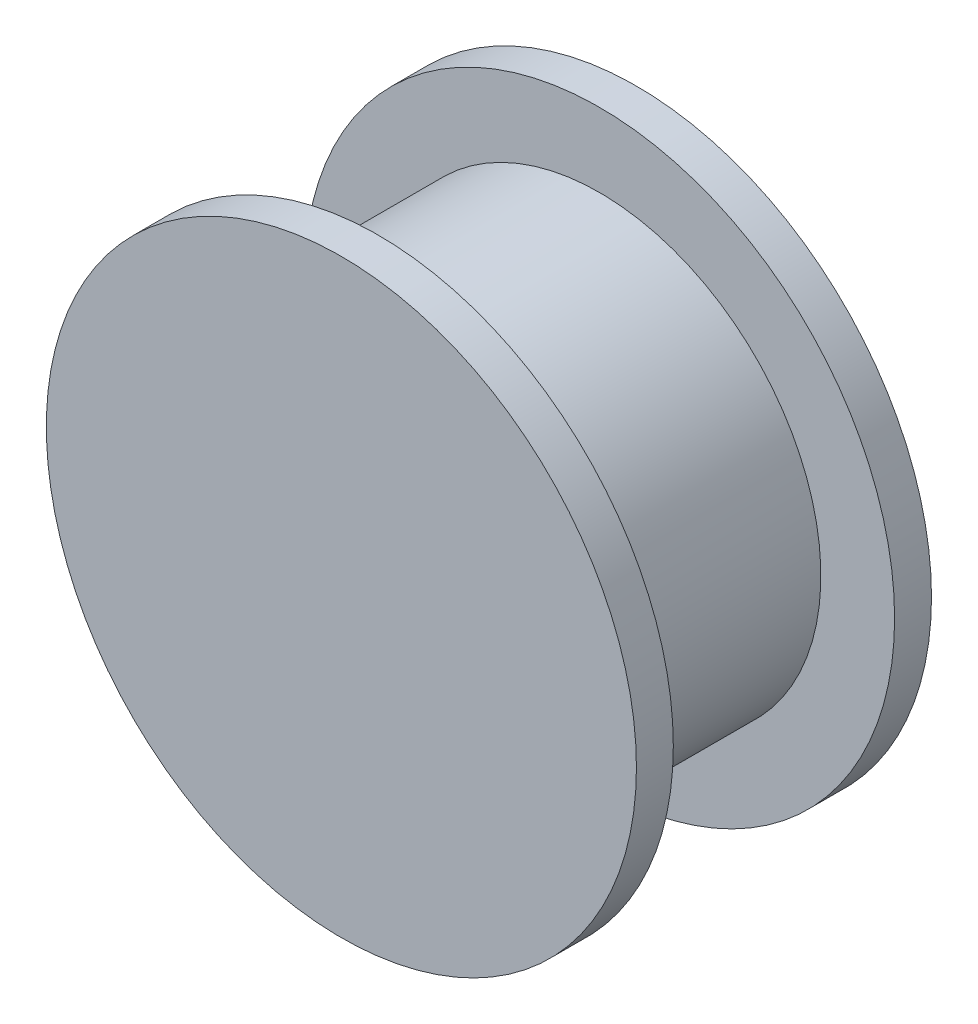
ISO-10303-21;
HEADER;
FILE_DESCRIPTION(('STEP AP214'),'2;1');
FILE_NAME('part.step','',(''),(''),'','','');
FILE_SCHEMA(('AUTOMOTIVE_DESIGN { 1 0 10303 214 1 1 1 1 }'));
ENDSEC;
DATA;
#1=APPLICATION_CONTEXT('core data for automotive mechanical design processes');
#2=APPLICATION_PROTOCOL_DEFINITION('international standard','automotive_design',2000,#1);
#3=PRODUCT_CONTEXT('',#1,'mechanical');
#4=PRODUCT('Part','Part','',(#3));
#5=PRODUCT_RELATED_PRODUCT_CATEGORY('part','',(#4));
#6=PRODUCT_DEFINITION_FORMATION('','',#4);
#7=PRODUCT_DEFINITION_CONTEXT('part definition',#1,'design');
#8=PRODUCT_DEFINITION('design','',#6,#7);
#9=PRODUCT_DEFINITION_SHAPE('','',#8);
#10=(LENGTH_UNIT() NAMED_UNIT(*) SI_UNIT(.MILLI.,.METRE.));
#11=(NAMED_UNIT(*) PLANE_ANGLE_UNIT() SI_UNIT($,.RADIAN.));
#12=(NAMED_UNIT(*) SI_UNIT($,.STERADIAN.) SOLID_ANGLE_UNIT());
#13=UNCERTAINTY_MEASURE_WITH_UNIT(LENGTH_MEASURE(1.E-05),#10,'distance_accuracy_value','');
#14=(GEOMETRIC_REPRESENTATION_CONTEXT(3) GLOBAL_UNCERTAINTY_ASSIGNED_CONTEXT((#13)) GLOBAL_UNIT_ASSIGNED_CONTEXT((#10,
#11,#12)) REPRESENTATION_CONTEXT('',''));
#15=CARTESIAN_POINT('',(0.,0.,0.));
#16=DIRECTION('',(0.,0.,1.));
#17=DIRECTION('',(1.,0.,0.));
#18=AXIS2_PLACEMENT_3D('',#15,#16,#17);
#19=CARTESIAN_POINT('',(0.,0.,3.175));
#20=DIRECTION('',(0.,0.,-1.));
#21=DIRECTION('',(-1.,0.,0.));
#22=AXIS2_PLACEMENT_3D('',#19,#20,#21);
#23=CYLINDRICAL_SURFACE('',#22,25.4);
#24=CARTESIAN_POINT('',(0.,0.,3.175));
#25=DIRECTION('',(0.,0.,1.));
#26=DIRECTION('',(1.,0.,0.));
#27=AXIS2_PLACEMENT_3D('',#24,#25,#26);
#28=CIRCLE('',#27,25.4);
#29=CARTESIAN_POINT('',(25.4,0.,3.175));
#30=VERTEX_POINT('',#29);
#31=EDGE_CURVE('E12',#30,#30,#28,.T.);
#32=ORIENTED_EDGE('',*,*,#31,.F.);
#33=EDGE_LOOP('',(#32));
#34=FACE_BOUND('',#33,.T.);
#35=CARTESIAN_POINT('',(0.,0.,0.));
#36=DIRECTION('',(0.,0.,1.));
#37=DIRECTION('',(1.,0.,0.));
#38=AXIS2_PLACEMENT_3D('',#35,#36,#37);
#39=CIRCLE('',#38,25.4);
#40=CARTESIAN_POINT('',(25.4,0.,0.));
#41=VERTEX_POINT('',#40);
#42=EDGE_CURVE('E48',#41,#41,#39,.T.);
#43=ORIENTED_EDGE('',*,*,#42,.T.);
#44=EDGE_LOOP('',(#43));
#45=FACE_BOUND('',#44,.T.);
#46=ADVANCED_FACE('F45',(#34,#45),#23,.T.);
#47=CARTESIAN_POINT('',(0.,0.,3.175));
#48=DIRECTION('',(0.,0.,1.));
#49=DIRECTION('',(1.,0.,0.));
#50=AXIS2_PLACEMENT_3D('',#47,#48,#49);
#51=PLANE('',#50);
#52=CARTESIAN_POINT('',(0.,0.,3.175));
#53=DIRECTION('',(0.,0.,1.));
#54=DIRECTION('',(1.,0.,0.));
#55=AXIS2_PLACEMENT_3D('',#52,#53,#54);
#56=CIRCLE('',#55,19.05);
#57=CARTESIAN_POINT('',(-19.05,0.,3.175));
#58=VERTEX_POINT('',#57);
#59=EDGE_CURVE('E57',#58,#58,#56,.T.);
#60=ORIENTED_EDGE('',*,*,#59,.F.);
#61=EDGE_LOOP('',(#60));
#62=FACE_BOUND('',#61,.T.);
#63=ORIENTED_EDGE('',*,*,#31,.T.);
#64=EDGE_LOOP('',(#63));
#65=FACE_BOUND('',#64,.T.);
#66=ADVANCED_FACE('F87',(#62,#65),#51,.T.);
#67=CARTESIAN_POINT('',(0.,0.,0.));
#68=DIRECTION('',(0.,0.,1.));
#69=DIRECTION('',(1.,0.,0.));
#70=AXIS2_PLACEMENT_3D('',#67,#68,#69);
#71=PLANE('',#70);
#72=ORIENTED_EDGE('',*,*,#42,.F.);
#73=EDGE_LOOP('',(#72));
#74=FACE_BOUND('',#73,.T.);
#75=ADVANCED_FACE('F92',(#74),#71,.F.);
#76=CARTESIAN_POINT('',(0.,0.,22.225));
#77=DIRECTION('',(0.,0.,-1.));
#78=DIRECTION('',(-1.,0.,0.));
#79=AXIS2_PLACEMENT_3D('',#76,#77,#78);
#80=CYLINDRICAL_SURFACE('',#79,19.05);
#81=CARTESIAN_POINT('',(0.,0.,22.225));
#82=DIRECTION('',(0.,0.,1.));
#83=DIRECTION('',(1.,0.,0.));
#84=AXIS2_PLACEMENT_3D('',#81,#82,#83);
#85=CIRCLE('',#84,19.05);
#86=CARTESIAN_POINT('',(-19.05,0.,22.225));
#87=VERTEX_POINT('',#86);
#88=EDGE_CURVE('E55',#87,#87,#85,.T.);
#89=CARTESIAN_POINT('',(-19.05,0.,22.225));
#90=CARTESIAN_POINT('',(-19.05,0.,22.0265625));
#91=CARTESIAN_POINT('',(-19.05,0.,21.828125));
#92=CARTESIAN_POINT('',(-19.05,0.,21.43125));
#93=CARTESIAN_POINT('',(-19.05,0.,21.2328125));
#94=CARTESIAN_POINT('',(-19.05,0.,20.8359375));
#95=CARTESIAN_POINT('',(-19.05,0.,20.6375));
#96=CARTESIAN_POINT('',(-19.05,0.,20.240625));
#97=CARTESIAN_POINT('',(-19.05,0.,20.0421875));
#98=CARTESIAN_POINT('',(-19.05,0.,19.6453125));
#99=CARTESIAN_POINT('',(-19.05,0.,19.446875));
#100=CARTESIAN_POINT('',(-19.05,0.,19.05));
#101=CARTESIAN_POINT('',(-19.05,0.,18.8515625));
#102=CARTESIAN_POINT('',(-19.05,0.,18.4546875));
#103=CARTESIAN_POINT('',(-19.05,0.,18.25625));
#104=CARTESIAN_POINT('',(-19.05,0.,17.859375));
#105=CARTESIAN_POINT('',(-19.05,0.,17.6609375));
#106=CARTESIAN_POINT('',(-19.05,0.,17.2640625));
#107=CARTESIAN_POINT('',(-19.05,0.,17.065625));
#108=CARTESIAN_POINT('',(-19.05,0.,16.66875));
#109=CARTESIAN_POINT('',(-19.05,0.,16.4703125));
#110=CARTESIAN_POINT('',(-19.05,0.,16.0734375));
#111=CARTESIAN_POINT('',(-19.05,0.,15.875));
#112=CARTESIAN_POINT('',(-19.05,0.,15.478125));
#113=CARTESIAN_POINT('',(-19.05,0.,15.2796875));
#114=CARTESIAN_POINT('',(-19.05,0.,14.8828125));
#115=CARTESIAN_POINT('',(-19.05,0.,14.684375));
#116=CARTESIAN_POINT('',(-19.05,0.,14.2875));
#117=CARTESIAN_POINT('',(-19.05,0.,14.0890625));
#118=CARTESIAN_POINT('',(-19.05,0.,13.6921875));
#119=CARTESIAN_POINT('',(-19.05,0.,13.49375));
#120=CARTESIAN_POINT('',(-19.05,0.,13.096875));
#121=CARTESIAN_POINT('',(-19.05,0.,12.8984375));
#122=CARTESIAN_POINT('',(-19.05,0.,12.5015625));
#123=CARTESIAN_POINT('',(-19.05,0.,12.303125));
#124=CARTESIAN_POINT('',(-19.05,0.,11.90625));
#125=CARTESIAN_POINT('',(-19.05,0.,11.7078125));
#126=CARTESIAN_POINT('',(-19.05,0.,11.3109375));
#127=CARTESIAN_POINT('',(-19.05,0.,11.1125));
#128=CARTESIAN_POINT('',(-19.05,0.,10.715625));
#129=CARTESIAN_POINT('',(-19.05,0.,10.5171875));
#130=CARTESIAN_POINT('',(-19.05,0.,10.1203125));
#131=CARTESIAN_POINT('',(-19.05,0.,9.921875));
#132=CARTESIAN_POINT('',(-19.05,0.,9.525));
#133=CARTESIAN_POINT('',(-19.05,0.,9.3265625));
#134=CARTESIAN_POINT('',(-19.05,0.,8.9296875));
#135=CARTESIAN_POINT('',(-19.05,0.,8.73125));
#136=CARTESIAN_POINT('',(-19.05,0.,8.334375));
#137=CARTESIAN_POINT('',(-19.05,0.,8.1359375));
#138=CARTESIAN_POINT('',(-19.05,0.,7.7390625));
#139=CARTESIAN_POINT('',(-19.05,0.,7.540625));
#140=CARTESIAN_POINT('',(-19.05,0.,7.14375));
#141=CARTESIAN_POINT('',(-19.05,0.,6.9453125));
#142=CARTESIAN_POINT('',(-19.05,0.,6.5484375));
#143=CARTESIAN_POINT('',(-19.05,0.,6.35));
#144=CARTESIAN_POINT('',(-19.05,0.,5.953125));
#145=CARTESIAN_POINT('',(-19.05,0.,5.7546875));
#146=CARTESIAN_POINT('',(-19.05,0.,5.3578125));
#147=CARTESIAN_POINT('',(-19.05,0.,5.159375));
#148=CARTESIAN_POINT('',(-19.05,0.,4.7625));
#149=CARTESIAN_POINT('',(-19.05,0.,4.5640625));
#150=CARTESIAN_POINT('',(-19.05,0.,4.1671875));
#151=CARTESIAN_POINT('',(-19.05,0.,3.96875));
#152=CARTESIAN_POINT('',(-19.05,0.,3.571875));
#153=CARTESIAN_POINT('',(-19.05,0.,3.3734375));
#154=CARTESIAN_POINT('',(-19.05,0.,3.175));
#155=B_SPLINE_CURVE_WITH_KNOTS('',3,(#89,#90,#91,#92,#93,#94,#95,#96,#97,#98,#99,#100,#101,#102,
#103,#104,#105,#106,#107,#108,#109,#110,#111,#112,#113,#114,#115,#116,#117,#118,#119,#120,#121,
#122,#123,#124,#125,#126,#127,#128,#129,#130,#131,#132,#133,#134,#135,#136,#137,#138,#139,#140,
#141,#142,#143,#144,#145,#146,#147,#148,#149,#150,#151,#152,#153,#154),.UNSPECIFIED.,.F.,.F.,(4,
2,2,2,2,2,2,2,2,2,2,2,2,2,2,2,2,2,2,2,2,2,2,2,2,2,2,2,2,2,2,2,4),(0.,0.5953125,1.190625,
1.7859375,2.38125,2.9765625,3.571875,4.1671875,4.7625,5.3578125,5.953125,6.5484375,7.14375,
7.7390625,8.334375,8.9296875,9.525,10.1203125,10.715625,11.3109375,11.90625,12.5015625,
13.096875,13.6921875,14.2875,14.8828125,15.478125,16.0734375,16.66875,17.2640625,17.859375,
18.4546875,19.05),.UNSPECIFIED.);
#156=EDGE_CURVE('BSEAM74',#87,#58,#155,.T.);
#157=ORIENTED_EDGE('',*,*,#88,.F.);
#158=ORIENTED_EDGE('',*,*,#59,.T.);
#159=ORIENTED_EDGE('',*,*,#156,.T.);
#160=ORIENTED_EDGE('',*,*,#156,.F.);
#161=EDGE_LOOP('',(#157,#159,#158,#160));
#162=FACE_BOUND('',#161,.T.);
#163=ADVANCED_FACE('F74',(#162),#80,.T.);
#164=CARTESIAN_POINT('',(0.,0.,25.4));
#165=DIRECTION('',(0.,0.,-1.));
#166=DIRECTION('',(-1.,0.,0.));
#167=AXIS2_PLACEMENT_3D('',#164,#165,#166);
#168=CYLINDRICAL_SURFACE('',#167,25.4);
#169=CARTESIAN_POINT('',(0.,0.,25.4));
#170=DIRECTION('',(0.,0.,1.));
#171=DIRECTION('',(1.,0.,0.));
#172=AXIS2_PLACEMENT_3D('',#169,#170,#171);
#173=CIRCLE('',#172,25.4);
#174=CARTESIAN_POINT('',(25.4,0.,25.4));
#175=VERTEX_POINT('',#174);
#176=EDGE_CURVE('E60',#175,#175,#173,.T.);
#177=ORIENTED_EDGE('',*,*,#176,.F.);
#178=EDGE_LOOP('',(#177));
#179=FACE_BOUND('',#178,.T.);
#180=CARTESIAN_POINT('',(0.,0.,22.225));
#181=DIRECTION('',(0.,0.,1.));
#182=DIRECTION('',(1.,0.,0.));
#183=AXIS2_PLACEMENT_3D('',#180,#181,#182);
#184=CIRCLE('',#183,25.4);
#185=CARTESIAN_POINT('',(25.4,0.,22.225));
#186=VERTEX_POINT('',#185);
#187=EDGE_CURVE('E63',#186,#186,#184,.T.);
#188=ORIENTED_EDGE('',*,*,#187,.T.);
#189=EDGE_LOOP('',(#188));
#190=FACE_BOUND('',#189,.T.);
#191=ADVANCED_FACE('F71',(#179,#190),#168,.T.);
#192=CARTESIAN_POINT('',(0.,0.,25.4));
#193=DIRECTION('',(0.,0.,1.));
#194=DIRECTION('',(1.,0.,0.));
#195=AXIS2_PLACEMENT_3D('',#192,#193,#194);
#196=PLANE('',#195);
#197=ORIENTED_EDGE('',*,*,#176,.T.);
#198=EDGE_LOOP('',(#197));
#199=FACE_BOUND('',#198,.T.);
#200=ADVANCED_FACE('F69',(#199),#196,.T.);
#201=CARTESIAN_POINT('',(0.,0.,22.225));
#202=DIRECTION('',(0.,0.,1.));
#203=DIRECTION('',(1.,0.,0.));
#204=AXIS2_PLACEMENT_3D('',#201,#202,#203);
#205=PLANE('',#204);
#206=ORIENTED_EDGE('',*,*,#88,.T.);
#207=EDGE_LOOP('',(#206));
#208=FACE_BOUND('',#207,.T.);
#209=ORIENTED_EDGE('',*,*,#187,.F.);
#210=EDGE_LOOP('',(#209));
#211=FACE_BOUND('',#210,.T.);
#212=ADVANCED_FACE('F78',(#208,#211),#205,.F.);
#213=CLOSED_SHELL('',(#46,#66,#75,#163,#191,#200,#212));
#214=MANIFOLD_SOLID_BREP('B2',#213);
#215=ADVANCED_BREP_SHAPE_REPRESENTATION('',(#18,#214),#14);
#216=SHAPE_DEFINITION_REPRESENTATION(#9,#215);
ENDSEC;
END-ISO-10303-21;
